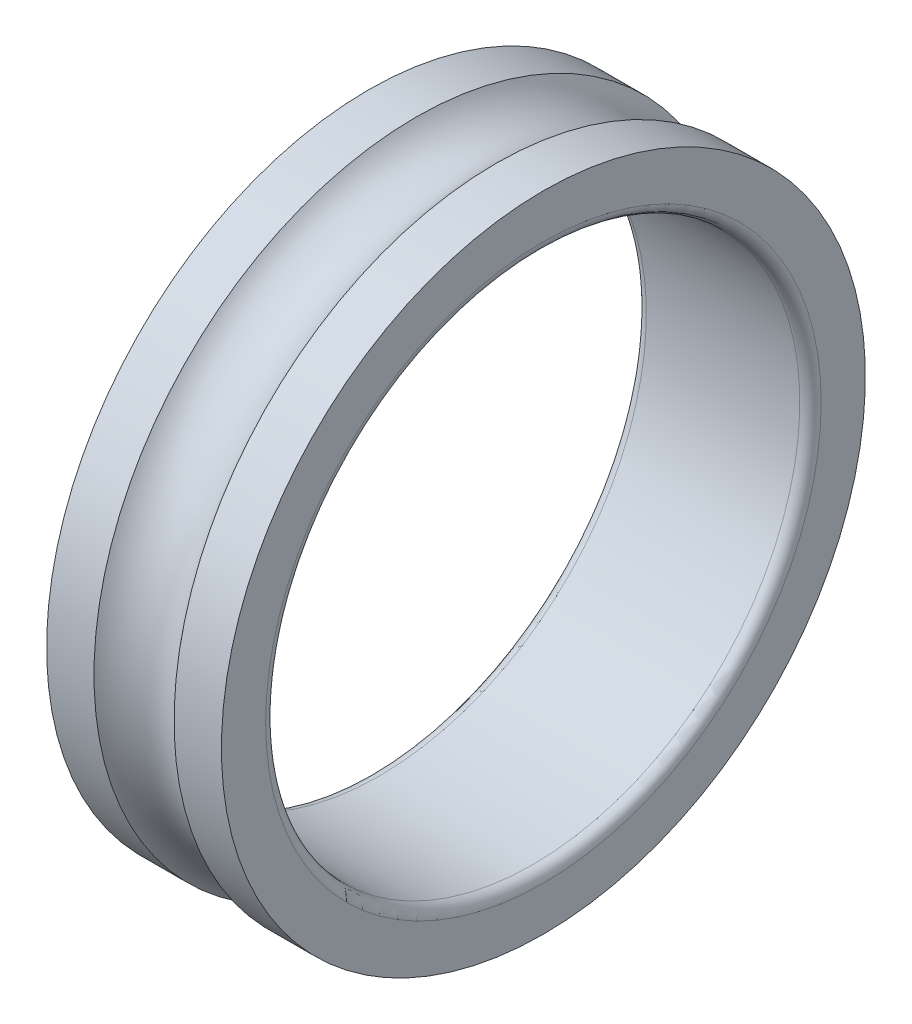
ISO-10303-21;
HEADER;
FILE_DESCRIPTION(('STEP AP214'),'2;1');
FILE_NAME('part.step','',(''),(''),'','','');
FILE_SCHEMA(('AUTOMOTIVE_DESIGN { 1 0 10303 214 1 1 1 1 }'));
ENDSEC;
DATA;
#1=APPLICATION_CONTEXT('core data for automotive mechanical design processes');
#2=APPLICATION_PROTOCOL_DEFINITION('international standard','automotive_design',2000,#1);
#3=PRODUCT_CONTEXT('',#1,'mechanical');
#4=PRODUCT('Part','Part','',(#3));
#5=PRODUCT_RELATED_PRODUCT_CATEGORY('part','',(#4));
#6=PRODUCT_DEFINITION_FORMATION('','',#4);
#7=PRODUCT_DEFINITION_CONTEXT('part definition',#1,'design');
#8=PRODUCT_DEFINITION('design','',#6,#7);
#9=PRODUCT_DEFINITION_SHAPE('','',#8);
#10=(LENGTH_UNIT() NAMED_UNIT(*) SI_UNIT(.MILLI.,.METRE.));
#11=(NAMED_UNIT(*) PLANE_ANGLE_UNIT() SI_UNIT($,.RADIAN.));
#12=(NAMED_UNIT(*) SI_UNIT($,.STERADIAN.) SOLID_ANGLE_UNIT());
#13=UNCERTAINTY_MEASURE_WITH_UNIT(LENGTH_MEASURE(1.E-05),#10,'distance_accuracy_value','');
#14=(GEOMETRIC_REPRESENTATION_CONTEXT(3) GLOBAL_UNCERTAINTY_ASSIGNED_CONTEXT((#13)) GLOBAL_UNIT_ASSIGNED_CONTEXT((#10,
#11,#12)) REPRESENTATION_CONTEXT('',''));
#15=CARTESIAN_POINT('',(0.,0.,0.));
#16=DIRECTION('',(0.,0.,1.));
#17=DIRECTION('',(1.,0.,0.));
#18=AXIS2_PLACEMENT_3D('',#15,#16,#17);
#19=CARTESIAN_POINT('',(15.562185748787,0.,0.));
#20=DIRECTION('',(-1.,0.,0.));
#21=DIRECTION('',(0.,1.,0.));
#22=AXIS2_PLACEMENT_3D('',#19,#20,#21);
#23=CYLINDRICAL_SURFACE('',#22,33.15);
#24=CARTESIAN_POINT('',(13.1243714975739,0.,0.));
#25=DIRECTION('',(1.,0.,0.));
#26=DIRECTION('',(0.,1.,0.));
#27=AXIS2_PLACEMENT_3D('',#24,#25,#26);
#28=CIRCLE('',#27,33.15);
#29=CARTESIAN_POINT('',(13.1243714975739,33.15,0.));
#30=VERTEX_POINT('',#29);
#31=EDGE_CURVE('E11',#30,#30,#28,.T.);
#32=ORIENTED_EDGE('',*,*,#31,.T.);
#33=EDGE_LOOP('',(#32));
#34=FACE_BOUND('',#33,.T.);
#35=CARTESIAN_POINT('',(18.,0.,0.));
#36=DIRECTION('',(1.,0.,0.));
#37=DIRECTION('',(0.,1.,0.));
#38=AXIS2_PLACEMENT_3D('',#35,#36,#37);
#39=CIRCLE('',#38,33.15);
#40=CARTESIAN_POINT('',(18.,33.15,0.));
#41=VERTEX_POINT('',#40);
#42=EDGE_CURVE('E57',#41,#41,#39,.T.);
#43=ORIENTED_EDGE('',*,*,#42,.F.);
#44=EDGE_LOOP('',(#43));
#45=FACE_BOUND('',#44,.T.);
#46=ADVANCED_FACE('F16',(#34,#45),#23,.T.);
#47=CARTESIAN_POINT('',(9.,0.,0.));
#48=DIRECTION('',(1.,0.,0.));
#49=DIRECTION('',(0.,0.,-1.));
#50=AXIS2_PLACEMENT_3D('',#47,#48,#49);
#51=TOROIDAL_SURFACE('',#50,36.25,5.1595);
#52=CARTESIAN_POINT('',(4.87562850242609,0.,0.));
#53=DIRECTION('',(1.,0.,0.));
#54=DIRECTION('',(0.,1.,0.));
#55=AXIS2_PLACEMENT_3D('',#52,#53,#54);
#56=CIRCLE('',#55,33.15);
#57=CARTESIAN_POINT('',(4.87562850242609,33.15,0.));
#58=VERTEX_POINT('',#57);
#59=EDGE_CURVE('E25',#58,#58,#56,.T.);
#60=ORIENTED_EDGE('',*,*,#59,.T.);
#61=EDGE_LOOP('',(#60));
#62=FACE_BOUND('',#61,.T.);
#63=ORIENTED_EDGE('',*,*,#31,.F.);
#64=EDGE_LOOP('',(#63));
#65=FACE_BOUND('',#64,.T.);
#66=ADVANCED_FACE('F82',(#62,#65),#51,.F.);
#67=CARTESIAN_POINT('',(2.43781425121304,0.,0.));
#68=DIRECTION('',(-1.,0.,0.));
#69=DIRECTION('',(0.,1.,0.));
#70=AXIS2_PLACEMENT_3D('',#67,#68,#69);
#71=CYLINDRICAL_SURFACE('',#70,33.15);
#72=CARTESIAN_POINT('',(0.,0.,0.));
#73=DIRECTION('',(1.,0.,0.));
#74=DIRECTION('',(0.,1.,0.));
#75=AXIS2_PLACEMENT_3D('',#72,#73,#74);
#76=CIRCLE('',#75,33.15);
#77=CARTESIAN_POINT('',(0.,33.15,0.));
#78=VERTEX_POINT('',#77);
#79=EDGE_CURVE('E55',#78,#78,#76,.T.);
#80=ORIENTED_EDGE('',*,*,#79,.T.);
#81=EDGE_LOOP('',(#80));
#82=FACE_BOUND('',#81,.T.);
#83=ORIENTED_EDGE('',*,*,#59,.F.);
#84=EDGE_LOOP('',(#83));
#85=FACE_BOUND('',#84,.T.);
#86=ADVANCED_FACE('F87',(#82,#85),#71,.T.);
#87=CARTESIAN_POINT('',(0.,30.875,0.));
#88=DIRECTION('',(-1.,0.,0.));
#89=DIRECTION('',(0.,-1.,0.));
#90=AXIS2_PLACEMENT_3D('',#87,#88,#89);
#91=PLANE('',#90);
#92=CARTESIAN_POINT('',(0.,0.,0.));
#93=DIRECTION('',(1.,0.,0.));
#94=DIRECTION('',(0.,1.,0.));
#95=AXIS2_PLACEMENT_3D('',#92,#93,#94);
#96=CIRCLE('',#95,28.6);
#97=CARTESIAN_POINT('',(0.,28.6,0.));
#98=VERTEX_POINT('',#97);
#99=EDGE_CURVE('E47',#98,#98,#96,.T.);
#100=ORIENTED_EDGE('',*,*,#99,.T.);
#101=EDGE_LOOP('',(#100));
#102=FACE_BOUND('',#101,.T.);
#103=ORIENTED_EDGE('',*,*,#79,.F.);
#104=EDGE_LOOP('',(#103));
#105=FACE_BOUND('',#104,.T.);
#106=ADVANCED_FACE('F93',(#102,#105),#91,.T.);
#107=CARTESIAN_POINT('',(1.1,0.,0.));
#108=DIRECTION('',(1.,0.,0.));
#109=DIRECTION('',(0.,0.,-1.));
#110=AXIS2_PLACEMENT_3D('',#107,#108,#109);
#111=TOROIDAL_SURFACE('',#110,28.6,1.1);
#112=CARTESIAN_POINT('',(1.1,0.,0.));
#113=DIRECTION('',(1.,0.,0.));
#114=DIRECTION('',(0.,1.,0.));
#115=AXIS2_PLACEMENT_3D('',#112,#113,#114);
#116=CIRCLE('',#115,27.5);
#117=CARTESIAN_POINT('',(1.1,27.5,0.));
#118=VERTEX_POINT('',#117);
#119=EDGE_CURVE('E51',#118,#118,#116,.T.);
#120=ORIENTED_EDGE('',*,*,#119,.T.);
#121=EDGE_LOOP('',(#120));
#122=FACE_BOUND('',#121,.T.);
#123=ORIENTED_EDGE('',*,*,#99,.F.);
#124=EDGE_LOOP('',(#123));
#125=FACE_BOUND('',#124,.T.);
#126=ADVANCED_FACE('F18',(#122,#125),#111,.T.);
#127=CARTESIAN_POINT('',(9.,0.,0.));
#128=DIRECTION('',(-1.,0.,0.));
#129=DIRECTION('',(0.,1.,0.));
#130=AXIS2_PLACEMENT_3D('',#127,#128,#129);
#131=CYLINDRICAL_SURFACE('',#130,27.5);
#132=CARTESIAN_POINT('',(16.9,0.,0.));
#133=DIRECTION('',(1.,0.,0.));
#134=DIRECTION('',(0.,1.,0.));
#135=AXIS2_PLACEMENT_3D('',#132,#133,#134);
#136=CIRCLE('',#135,27.5);
#137=CARTESIAN_POINT('',(16.9,27.5,0.));
#138=VERTEX_POINT('',#137);
#139=EDGE_CURVE('E54',#138,#138,#136,.T.);
#140=ORIENTED_EDGE('',*,*,#139,.T.);
#141=EDGE_LOOP('',(#140));
#142=FACE_BOUND('',#141,.T.);
#143=ORIENTED_EDGE('',*,*,#119,.F.);
#144=EDGE_LOOP('',(#143));
#145=FACE_BOUND('',#144,.T.);
#146=ADVANCED_FACE('F78',(#142,#145),#131,.F.);
#147=CARTESIAN_POINT('',(16.9,0.,0.));
#148=DIRECTION('',(1.,0.,0.));
#149=DIRECTION('',(0.,0.,-1.));
#150=AXIS2_PLACEMENT_3D('',#147,#148,#149);
#151=TOROIDAL_SURFACE('',#150,28.6,1.1);
#152=CARTESIAN_POINT('',(18.,0.,0.));
#153=DIRECTION('',(1.,0.,0.));
#154=DIRECTION('',(0.,1.,0.));
#155=AXIS2_PLACEMENT_3D('',#152,#153,#154);
#156=CIRCLE('',#155,28.6);
#157=CARTESIAN_POINT('',(18.,28.6,0.));
#158=VERTEX_POINT('',#157);
#159=EDGE_CURVE('E62',#158,#158,#156,.T.);
#160=ORIENTED_EDGE('',*,*,#159,.T.);
#161=EDGE_LOOP('',(#160));
#162=FACE_BOUND('',#161,.T.);
#163=ORIENTED_EDGE('',*,*,#139,.F.);
#164=EDGE_LOOP('',(#163));
#165=FACE_BOUND('',#164,.T.);
#166=ADVANCED_FACE('F67',(#162,#165),#151,.T.);
#167=CARTESIAN_POINT('',(18.,30.875,0.));
#168=DIRECTION('',(1.,0.,0.));
#169=DIRECTION('',(0.,1.,0.));
#170=AXIS2_PLACEMENT_3D('',#167,#168,#169);
#171=PLANE('',#170);
#172=ORIENTED_EDGE('',*,*,#42,.T.);
#173=EDGE_LOOP('',(#172));
#174=FACE_BOUND('',#173,.T.);
#175=ORIENTED_EDGE('',*,*,#159,.F.);
#176=EDGE_LOOP('',(#175));
#177=FACE_BOUND('',#176,.T.);
#178=ADVANCED_FACE('F70',(#174,#177),#171,.T.);
#179=CLOSED_SHELL('',(#46,#66,#86,#106,#126,#146,#166,#178));
#180=MANIFOLD_SOLID_BREP('B1',#179);
#181=ADVANCED_BREP_SHAPE_REPRESENTATION('',(#18,#180),#14);
#182=SHAPE_DEFINITION_REPRESENTATION(#9,#181);
ENDSEC;
END-ISO-10303-21;
